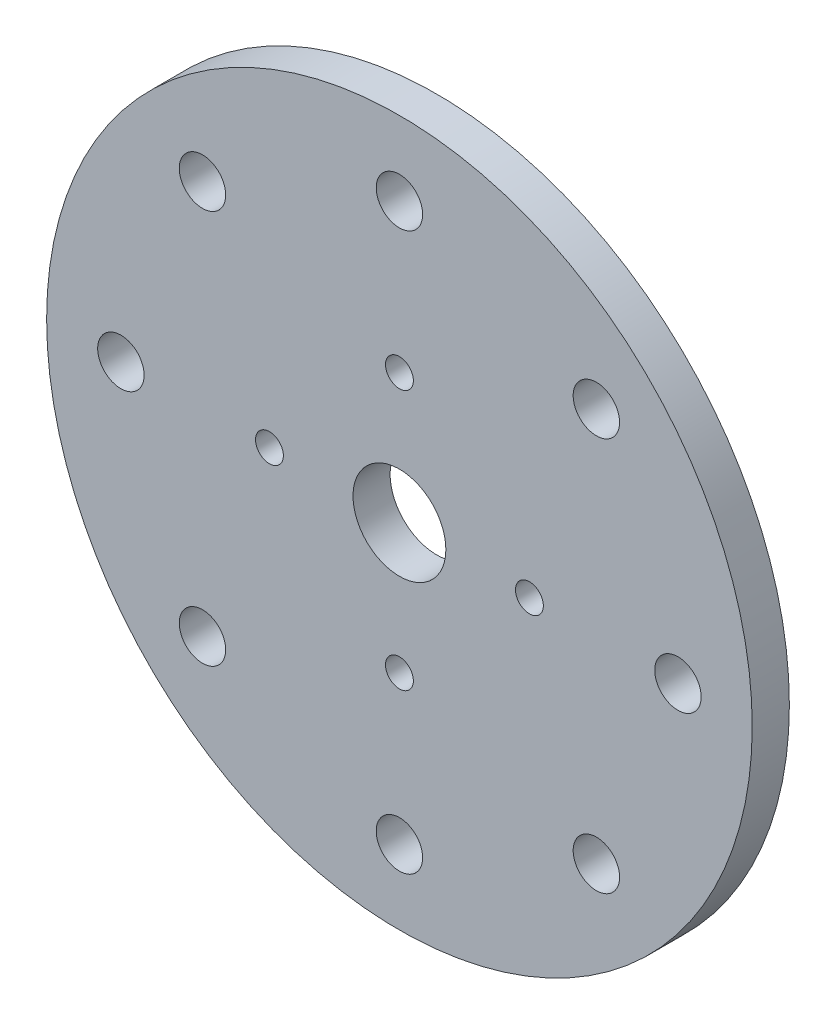
ISO-10303-21;
HEADER;
FILE_DESCRIPTION(('STEP AP214'),'2;1');
FILE_NAME('part.step','',(''),(''),'','','');
FILE_SCHEMA(('AUTOMOTIVE_DESIGN { 1 0 10303 214 1 1 1 1 }'));
ENDSEC;
DATA;
#1=APPLICATION_CONTEXT('core data for automotive mechanical design processes');
#2=APPLICATION_PROTOCOL_DEFINITION('international standard','automotive_design',2000,#1);
#3=PRODUCT_CONTEXT('',#1,'mechanical');
#4=PRODUCT('Part','Part','',(#3));
#5=PRODUCT_RELATED_PRODUCT_CATEGORY('part','',(#4));
#6=PRODUCT_DEFINITION_FORMATION('','',#4);
#7=PRODUCT_DEFINITION_CONTEXT('part definition',#1,'design');
#8=PRODUCT_DEFINITION('design','',#6,#7);
#9=PRODUCT_DEFINITION_SHAPE('','',#8);
#10=(LENGTH_UNIT() NAMED_UNIT(*) SI_UNIT(.MILLI.,.METRE.));
#11=(NAMED_UNIT(*) PLANE_ANGLE_UNIT() SI_UNIT($,.RADIAN.));
#12=(NAMED_UNIT(*) SI_UNIT($,.STERADIAN.) SOLID_ANGLE_UNIT());
#13=UNCERTAINTY_MEASURE_WITH_UNIT(LENGTH_MEASURE(1.E-05),#10,'distance_accuracy_value','');
#14=(GEOMETRIC_REPRESENTATION_CONTEXT(3) GLOBAL_UNCERTAINTY_ASSIGNED_CONTEXT((#13)) GLOBAL_UNIT_ASSIGNED_CONTEXT((#10,
#11,#12)) REPRESENTATION_CONTEXT('',''));
#15=CARTESIAN_POINT('',(0.,0.,0.));
#16=DIRECTION('',(0.,0.,1.));
#17=DIRECTION('',(1.,0.,0.));
#18=AXIS2_PLACEMENT_3D('',#15,#16,#17);
#19=CARTESIAN_POINT('',(0.,0.,4.));
#20=DIRECTION('',(0.,0.,1.));
#21=DIRECTION('',(1.,0.,0.));
#22=AXIS2_PLACEMENT_3D('',#19,#20,#21);
#23=PLANE('',#22);
#24=CARTESIAN_POINT('',(7.90664347494893E-13,-14.,4.));
#25=DIRECTION('',(0.,0.,1.));
#26=DIRECTION('',(1.,0.,0.));
#27=AXIS2_PLACEMENT_3D('',#24,#25,#26);
#28=CIRCLE('',#27,1.50000000000085);
#29=CARTESIAN_POINT('',(1.50000000000164,-14.,4.));
#30=VERTEX_POINT('',#29);
#31=EDGE_CURVE('E109',#30,#30,#28,.T.);
#32=ORIENTED_EDGE('',*,*,#31,.F.);
#33=EDGE_LOOP('',(#32));
#34=FACE_BOUND('',#33,.T.);
#35=CARTESIAN_POINT('',(-21.2132034355961,21.2132034355955,4.));
#36=DIRECTION('',(0.,0.,1.));
#37=DIRECTION('',(1.,0.,0.));
#38=AXIS2_PLACEMENT_3D('',#35,#36,#37);
#39=CIRCLE('',#38,2.50000000000097);
#40=CARTESIAN_POINT('',(-18.7132034355951,21.2132034355955,4.));
#41=VERTEX_POINT('',#40);
#42=EDGE_CURVE('E97',#41,#41,#39,.T.);
#43=ORIENTED_EDGE('',*,*,#42,.F.);
#44=EDGE_LOOP('',(#43));
#45=FACE_BOUND('',#44,.T.);
#46=CARTESIAN_POINT('',(-21.2132034355943,-21.2132034355973,4.));
#47=DIRECTION('',(0.,0.,1.));
#48=DIRECTION('',(1.,0.,0.));
#49=AXIS2_PLACEMENT_3D('',#46,#47,#48);
#50=CIRCLE('',#49,2.5000000000026);
#51=CARTESIAN_POINT('',(-18.7132034355917,-21.2132034355973,4.));
#52=VERTEX_POINT('',#51);
#53=EDGE_CURVE('E85',#52,#52,#50,.T.);
#54=ORIENTED_EDGE('',*,*,#53,.F.);
#55=EDGE_LOOP('',(#54));
#56=FACE_BOUND('',#55,.T.);
#57=CARTESIAN_POINT('',(21.2132034355986,-21.2132034355955,4.));
#58=DIRECTION('',(0.,0.,1.));
#59=DIRECTION('',(1.,0.,0.));
#60=AXIS2_PLACEMENT_3D('',#57,#58,#59);
#61=CIRCLE('',#60,2.50000000000197);
#62=CARTESIAN_POINT('',(23.7132034356006,-21.2132034355955,4.));
#63=VERTEX_POINT('',#62);
#64=EDGE_CURVE('E73',#63,#63,#61,.T.);
#65=ORIENTED_EDGE('',*,*,#64,.F.);
#66=EDGE_LOOP('',(#65));
#67=FACE_BOUND('',#66,.T.);
#68=CARTESIAN_POINT('',(21.2132034355968,21.2132034355973,4.));
#69=DIRECTION('',(0.,0.,1.));
#70=DIRECTION('',(1.,0.,0.));
#71=AXIS2_PLACEMENT_3D('',#68,#69,#70);
#72=CIRCLE('',#71,2.50000000000015);
#73=CARTESIAN_POINT('',(23.7132034355969,21.2132034355973,4.));
#74=VERTEX_POINT('',#73);
#75=EDGE_CURVE('E61',#74,#74,#72,.T.);
#76=ORIENTED_EDGE('',*,*,#75,.F.);
#77=EDGE_LOOP('',(#76));
#78=FACE_BOUND('',#77,.T.);
#79=CARTESIAN_POINT('',(0.,30.,4.));
#80=DIRECTION('',(0.,0.,1.));
#81=DIRECTION('',(1.,0.,0.));
#82=AXIS2_PLACEMENT_3D('',#79,#80,#81);
#83=CIRCLE('',#82,2.5);
#84=CARTESIAN_POINT('',(2.5,30.,4.));
#85=VERTEX_POINT('',#84);
#86=EDGE_CURVE('E49',#85,#85,#83,.T.);
#87=ORIENTED_EDGE('',*,*,#86,.F.);
#88=EDGE_LOOP('',(#87));
#89=FACE_BOUND('',#88,.T.);
#90=CARTESIAN_POINT('',(0.,0.,4.));
#91=DIRECTION('',(0.,0.,1.));
#92=DIRECTION('',(1.,0.,0.));
#93=AXIS2_PLACEMENT_3D('',#90,#91,#92);
#94=CIRCLE('',#93,38.);
#95=CARTESIAN_POINT('',(38.,0.,4.));
#96=VERTEX_POINT('',#95);
#97=EDGE_CURVE('E10',#96,#96,#94,.T.);
#98=ORIENTED_EDGE('',*,*,#97,.T.);
#99=EDGE_LOOP('',(#98));
#100=FACE_BOUND('',#99,.T.);
#101=CARTESIAN_POINT('',(0.,0.,4.));
#102=DIRECTION('',(0.,0.,1.));
#103=DIRECTION('',(1.,0.,0.));
#104=AXIS2_PLACEMENT_3D('',#101,#102,#103);
#105=CIRCLE('',#104,5.);
#106=CARTESIAN_POINT('',(5.,0.,4.));
#107=VERTEX_POINT('',#106);
#108=EDGE_CURVE('E44',#107,#107,#105,.T.);
#109=ORIENTED_EDGE('',*,*,#108,.F.);
#110=EDGE_LOOP('',(#109));
#111=FACE_BOUND('',#110,.T.);
#112=CARTESIAN_POINT('',(0.,14.,4.));
#113=DIRECTION('',(0.,0.,1.));
#114=DIRECTION('',(1.,0.,0.));
#115=AXIS2_PLACEMENT_3D('',#112,#113,#114);
#116=CIRCLE('',#115,1.5);
#117=CARTESIAN_POINT('',(1.5,14.,4.));
#118=VERTEX_POINT('',#117);
#119=EDGE_CURVE('E55',#118,#118,#116,.T.);
#120=ORIENTED_EDGE('',*,*,#119,.F.);
#121=EDGE_LOOP('',(#120));
#122=FACE_BOUND('',#121,.T.);
#123=CARTESIAN_POINT('',(30.0000000000013,1.27346601377202E-12,4.));
#124=DIRECTION('',(0.,0.,1.));
#125=DIRECTION('',(1.,0.,0.));
#126=AXIS2_PLACEMENT_3D('',#123,#124,#125);
#127=CIRCLE('',#126,2.50000000000095);
#128=CARTESIAN_POINT('',(32.5000000000022,1.27346601377202E-12,4.));
#129=VERTEX_POINT('',#128);
#130=EDGE_CURVE('E67',#129,#129,#127,.T.);
#131=ORIENTED_EDGE('',*,*,#130,.F.);
#132=EDGE_LOOP('',(#131));
#133=FACE_BOUND('',#132,.T.);
#134=CARTESIAN_POINT('',(2.54693202754403E-12,-30.,4.));
#135=DIRECTION('',(0.,0.,1.));
#136=DIRECTION('',(1.,0.,0.));
#137=AXIS2_PLACEMENT_3D('',#134,#135,#136);
#138=CIRCLE('',#137,2.50000000000264);
#139=CARTESIAN_POINT('',(2.50000000000518,-30.,4.));
#140=VERTEX_POINT('',#139);
#141=EDGE_CURVE('E79',#140,#140,#138,.T.);
#142=ORIENTED_EDGE('',*,*,#141,.F.);
#143=EDGE_LOOP('',(#142));
#144=FACE_BOUND('',#143,.T.);
#145=CARTESIAN_POINT('',(-29.9999999999987,-1.27713995416946E-12,4.));
#146=DIRECTION('',(0.,0.,1.));
#147=DIRECTION('',(1.,0.,0.));
#148=AXIS2_PLACEMENT_3D('',#145,#146,#147);
#149=CIRCLE('',#148,2.5000000000019);
#150=CARTESIAN_POINT('',(-27.4999999999968,-1.27713995416946E-12,4.));
#151=VERTEX_POINT('',#150);
#152=EDGE_CURVE('E91',#151,#151,#149,.T.);
#153=ORIENTED_EDGE('',*,*,#152,.F.);
#154=EDGE_LOOP('',(#153));
#155=FACE_BOUND('',#154,.T.);
#156=CARTESIAN_POINT('',(14.,0.,4.));
#157=DIRECTION('',(0.,0.,1.));
#158=DIRECTION('',(1.,0.,0.));
#159=AXIS2_PLACEMENT_3D('',#156,#157,#158);
#160=CIRCLE('',#159,1.5);
#161=CARTESIAN_POINT('',(15.5,0.,4.));
#162=VERTEX_POINT('',#161);
#163=EDGE_CURVE('E103',#162,#162,#160,.T.);
#164=ORIENTED_EDGE('',*,*,#163,.F.);
#165=EDGE_LOOP('',(#164));
#166=FACE_BOUND('',#165,.T.);
#167=CARTESIAN_POINT('',(-14.,1.46642216231412E-13,4.));
#168=DIRECTION('',(0.,0.,1.));
#169=DIRECTION('',(1.,0.,0.));
#170=AXIS2_PLACEMENT_3D('',#167,#168,#169);
#171=CIRCLE('',#170,1.5);
#172=CARTESIAN_POINT('',(-12.5,1.46642216231412E-13,4.));
#173=VERTEX_POINT('',#172);
#174=EDGE_CURVE('E115',#173,#173,#171,.T.);
#175=ORIENTED_EDGE('',*,*,#174,.F.);
#176=EDGE_LOOP('',(#175));
#177=FACE_BOUND('',#176,.T.);
#178=ADVANCED_FACE('F33',(#34,#45,#56,#67,#78,#89,#100,#111,#122,#133,#144,#155,#166,#177),#23,.T.);
#179=CARTESIAN_POINT('',(0.,0.,0.));
#180=DIRECTION('',(0.,0.,1.));
#181=DIRECTION('',(1.,0.,0.));
#182=AXIS2_PLACEMENT_3D('',#179,#180,#181);
#183=PLANE('',#182);
#184=CARTESIAN_POINT('',(0.,0.,0.));
#185=DIRECTION('',(0.,0.,1.));
#186=DIRECTION('',(1.,0.,0.));
#187=AXIS2_PLACEMENT_3D('',#184,#185,#186);
#188=CIRCLE('',#187,38.);
#189=CARTESIAN_POINT('',(38.,0.,0.));
#190=VERTEX_POINT('',#189);
#191=EDGE_CURVE('E37',#190,#190,#188,.T.);
#192=ORIENTED_EDGE('',*,*,#191,.F.);
#193=EDGE_LOOP('',(#192));
#194=FACE_BOUND('',#193,.T.);
#195=CARTESIAN_POINT('',(0.,0.,0.));
#196=DIRECTION('',(0.,0.,1.));
#197=DIRECTION('',(1.,0.,0.));
#198=AXIS2_PLACEMENT_3D('',#195,#196,#197);
#199=CIRCLE('',#198,5.);
#200=CARTESIAN_POINT('',(5.,0.,0.));
#201=VERTEX_POINT('',#200);
#202=EDGE_CURVE('E46',#201,#201,#199,.T.);
#203=ORIENTED_EDGE('',*,*,#202,.T.);
#204=EDGE_LOOP('',(#203));
#205=FACE_BOUND('',#204,.T.);
#206=CARTESIAN_POINT('',(0.,30.,0.));
#207=DIRECTION('',(0.,0.,1.));
#208=DIRECTION('',(1.,0.,0.));
#209=AXIS2_PLACEMENT_3D('',#206,#207,#208);
#210=CIRCLE('',#209,2.5);
#211=CARTESIAN_POINT('',(2.5,30.,0.));
#212=VERTEX_POINT('',#211);
#213=EDGE_CURVE('E52',#212,#212,#210,.T.);
#214=ORIENTED_EDGE('',*,*,#213,.T.);
#215=EDGE_LOOP('',(#214));
#216=FACE_BOUND('',#215,.T.);
#217=CARTESIAN_POINT('',(0.,14.,0.));
#218=DIRECTION('',(0.,0.,1.));
#219=DIRECTION('',(1.,0.,0.));
#220=AXIS2_PLACEMENT_3D('',#217,#218,#219);
#221=CIRCLE('',#220,1.5);
#222=CARTESIAN_POINT('',(1.5,14.,0.));
#223=VERTEX_POINT('',#222);
#224=EDGE_CURVE('E58',#223,#223,#221,.T.);
#225=ORIENTED_EDGE('',*,*,#224,.T.);
#226=EDGE_LOOP('',(#225));
#227=FACE_BOUND('',#226,.T.);
#228=CARTESIAN_POINT('',(21.2132034355968,21.2132034355973,0.));
#229=DIRECTION('',(0.,0.,1.));
#230=DIRECTION('',(1.,0.,0.));
#231=AXIS2_PLACEMENT_3D('',#228,#229,#230);
#232=CIRCLE('',#231,2.50000000000015);
#233=CARTESIAN_POINT('',(23.7132034355969,21.2132034355973,0.));
#234=VERTEX_POINT('',#233);
#235=EDGE_CURVE('E64',#234,#234,#232,.T.);
#236=ORIENTED_EDGE('',*,*,#235,.T.);
#237=EDGE_LOOP('',(#236));
#238=FACE_BOUND('',#237,.T.);
#239=CARTESIAN_POINT('',(30.0000000000013,1.27346601377202E-12,0.));
#240=DIRECTION('',(0.,0.,1.));
#241=DIRECTION('',(1.,0.,0.));
#242=AXIS2_PLACEMENT_3D('',#239,#240,#241);
#243=CIRCLE('',#242,2.50000000000095);
#244=CARTESIAN_POINT('',(32.5000000000022,1.27346601377202E-12,0.));
#245=VERTEX_POINT('',#244);
#246=EDGE_CURVE('E70',#245,#245,#243,.T.);
#247=ORIENTED_EDGE('',*,*,#246,.T.);
#248=EDGE_LOOP('',(#247));
#249=FACE_BOUND('',#248,.T.);
#250=CARTESIAN_POINT('',(21.2132034355986,-21.2132034355955,0.));
#251=DIRECTION('',(0.,0.,1.));
#252=DIRECTION('',(1.,0.,0.));
#253=AXIS2_PLACEMENT_3D('',#250,#251,#252);
#254=CIRCLE('',#253,2.50000000000197);
#255=CARTESIAN_POINT('',(23.7132034356006,-21.2132034355955,0.));
#256=VERTEX_POINT('',#255);
#257=EDGE_CURVE('E76',#256,#256,#254,.T.);
#258=ORIENTED_EDGE('',*,*,#257,.T.);
#259=EDGE_LOOP('',(#258));
#260=FACE_BOUND('',#259,.T.);
#261=CARTESIAN_POINT('',(2.54693202754403E-12,-30.,0.));
#262=DIRECTION('',(0.,0.,1.));
#263=DIRECTION('',(1.,0.,0.));
#264=AXIS2_PLACEMENT_3D('',#261,#262,#263);
#265=CIRCLE('',#264,2.50000000000264);
#266=CARTESIAN_POINT('',(2.50000000000518,-30.,0.));
#267=VERTEX_POINT('',#266);
#268=EDGE_CURVE('E82',#267,#267,#265,.T.);
#269=ORIENTED_EDGE('',*,*,#268,.T.);
#270=EDGE_LOOP('',(#269));
#271=FACE_BOUND('',#270,.T.);
#272=CARTESIAN_POINT('',(-21.2132034355943,-21.2132034355973,0.));
#273=DIRECTION('',(0.,0.,1.));
#274=DIRECTION('',(1.,0.,0.));
#275=AXIS2_PLACEMENT_3D('',#272,#273,#274);
#276=CIRCLE('',#275,2.5000000000026);
#277=CARTESIAN_POINT('',(-18.7132034355917,-21.2132034355973,0.));
#278=VERTEX_POINT('',#277);
#279=EDGE_CURVE('E88',#278,#278,#276,.T.);
#280=ORIENTED_EDGE('',*,*,#279,.T.);
#281=EDGE_LOOP('',(#280));
#282=FACE_BOUND('',#281,.T.);
#283=CARTESIAN_POINT('',(-29.9999999999987,-1.27713995416946E-12,0.));
#284=DIRECTION('',(0.,0.,1.));
#285=DIRECTION('',(1.,0.,0.));
#286=AXIS2_PLACEMENT_3D('',#283,#284,#285);
#287=CIRCLE('',#286,2.5000000000019);
#288=CARTESIAN_POINT('',(-27.4999999999968,-1.27713995416946E-12,0.));
#289=VERTEX_POINT('',#288);
#290=EDGE_CURVE('E94',#289,#289,#287,.T.);
#291=ORIENTED_EDGE('',*,*,#290,.T.);
#292=EDGE_LOOP('',(#291));
#293=FACE_BOUND('',#292,.T.);
#294=CARTESIAN_POINT('',(-21.2132034355961,21.2132034355955,0.));
#295=DIRECTION('',(0.,0.,1.));
#296=DIRECTION('',(1.,0.,0.));
#297=AXIS2_PLACEMENT_3D('',#294,#295,#296);
#298=CIRCLE('',#297,2.50000000000097);
#299=CARTESIAN_POINT('',(-18.7132034355951,21.2132034355955,0.));
#300=VERTEX_POINT('',#299);
#301=EDGE_CURVE('E100',#300,#300,#298,.T.);
#302=ORIENTED_EDGE('',*,*,#301,.T.);
#303=EDGE_LOOP('',(#302));
#304=FACE_BOUND('',#303,.T.);
#305=CARTESIAN_POINT('',(14.,0.,0.));
#306=DIRECTION('',(0.,0.,1.));
#307=DIRECTION('',(1.,0.,0.));
#308=AXIS2_PLACEMENT_3D('',#305,#306,#307);
#309=CIRCLE('',#308,1.5);
#310=CARTESIAN_POINT('',(15.5,0.,0.));
#311=VERTEX_POINT('',#310);
#312=EDGE_CURVE('E106',#311,#311,#309,.T.);
#313=ORIENTED_EDGE('',*,*,#312,.T.);
#314=EDGE_LOOP('',(#313));
#315=FACE_BOUND('',#314,.T.);
#316=CARTESIAN_POINT('',(7.90664347494893E-13,-14.,0.));
#317=DIRECTION('',(0.,0.,1.));
#318=DIRECTION('',(1.,0.,0.));
#319=AXIS2_PLACEMENT_3D('',#316,#317,#318);
#320=CIRCLE('',#319,1.50000000000085);
#321=CARTESIAN_POINT('',(1.50000000000164,-14.,0.));
#322=VERTEX_POINT('',#321);
#323=EDGE_CURVE('E112',#322,#322,#320,.T.);
#324=ORIENTED_EDGE('',*,*,#323,.T.);
#325=EDGE_LOOP('',(#324));
#326=FACE_BOUND('',#325,.T.);
#327=CARTESIAN_POINT('',(-14.,1.46642216231412E-13,0.));
#328=DIRECTION('',(0.,0.,1.));
#329=DIRECTION('',(1.,0.,0.));
#330=AXIS2_PLACEMENT_3D('',#327,#328,#329);
#331=CIRCLE('',#330,1.5);
#332=CARTESIAN_POINT('',(-12.5,1.46642216231412E-13,0.));
#333=VERTEX_POINT('',#332);
#334=EDGE_CURVE('E118',#333,#333,#331,.T.);
#335=ORIENTED_EDGE('',*,*,#334,.T.);
#336=EDGE_LOOP('',(#335));
#337=FACE_BOUND('',#336,.T.);
#338=ADVANCED_FACE('F128',(#194,#205,#216,#227,#238,#249,#260,#271,#282,#293,#304,#315,#326,
#337),#183,.F.);
#339=CARTESIAN_POINT('',(0.,0.,4.));
#340=DIRECTION('',(0.,0.,-1.));
#341=DIRECTION('',(-1.,0.,0.));
#342=AXIS2_PLACEMENT_3D('',#339,#340,#341);
#343=CYLINDRICAL_SURFACE('',#342,38.);
#344=ORIENTED_EDGE('',*,*,#97,.F.);
#345=EDGE_LOOP('',(#344));
#346=FACE_BOUND('',#345,.T.);
#347=ORIENTED_EDGE('',*,*,#191,.T.);
#348=EDGE_LOOP('',(#347));
#349=FACE_BOUND('',#348,.T.);
#350=ADVANCED_FACE('F35',(#346,#349),#343,.T.);
#351=CARTESIAN_POINT('',(0.,0.,4.));
#352=DIRECTION('',(0.,0.,-1.));
#353=DIRECTION('',(-1.,0.,0.));
#354=AXIS2_PLACEMENT_3D('',#351,#352,#353);
#355=CYLINDRICAL_SURFACE('',#354,5.);
#356=ORIENTED_EDGE('',*,*,#108,.T.);
#357=EDGE_LOOP('',(#356));
#358=FACE_BOUND('',#357,.T.);
#359=ORIENTED_EDGE('',*,*,#202,.F.);
#360=EDGE_LOOP('',(#359));
#361=FACE_BOUND('',#360,.T.);
#362=ADVANCED_FACE('F138',(#358,#361),#355,.F.);
#363=CARTESIAN_POINT('',(0.,30.,4.));
#364=DIRECTION('',(0.,0.,-1.));
#365=DIRECTION('',(-1.,0.,0.));
#366=AXIS2_PLACEMENT_3D('',#363,#364,#365);
#367=CYLINDRICAL_SURFACE('',#366,2.5);
#368=ORIENTED_EDGE('',*,*,#86,.T.);
#369=EDGE_LOOP('',(#368));
#370=FACE_BOUND('',#369,.T.);
#371=ORIENTED_EDGE('',*,*,#213,.F.);
#372=EDGE_LOOP('',(#371));
#373=FACE_BOUND('',#372,.T.);
#374=ADVANCED_FACE('F141',(#370,#373),#367,.F.);
#375=CARTESIAN_POINT('',(0.,14.,4.));
#376=DIRECTION('',(0.,0.,-1.));
#377=DIRECTION('',(-1.,0.,0.));
#378=AXIS2_PLACEMENT_3D('',#375,#376,#377);
#379=CYLINDRICAL_SURFACE('',#378,1.5);
#380=ORIENTED_EDGE('',*,*,#119,.T.);
#381=EDGE_LOOP('',(#380));
#382=FACE_BOUND('',#381,.T.);
#383=ORIENTED_EDGE('',*,*,#224,.F.);
#384=EDGE_LOOP('',(#383));
#385=FACE_BOUND('',#384,.T.);
#386=ADVANCED_FACE('F145',(#382,#385),#379,.F.);
#387=CARTESIAN_POINT('',(21.2132034355968,21.2132034355973,4.));
#388=DIRECTION('',(0.,0.,-1.));
#389=DIRECTION('',(-1.,0.,0.));
#390=AXIS2_PLACEMENT_3D('',#387,#388,#389);
#391=CYLINDRICAL_SURFACE('',#390,2.50000000000015);
#392=ORIENTED_EDGE('',*,*,#75,.T.);
#393=EDGE_LOOP('',(#392));
#394=FACE_BOUND('',#393,.T.);
#395=ORIENTED_EDGE('',*,*,#235,.F.);
#396=EDGE_LOOP('',(#395));
#397=FACE_BOUND('',#396,.T.);
#398=ADVANCED_FACE('F149',(#394,#397),#391,.F.);
#399=CARTESIAN_POINT('',(30.0000000000013,1.27346601377202E-12,4.));
#400=DIRECTION('',(0.,0.,-1.));
#401=DIRECTION('',(-1.,0.,0.));
#402=AXIS2_PLACEMENT_3D('',#399,#400,#401);
#403=CYLINDRICAL_SURFACE('',#402,2.50000000000095);
#404=ORIENTED_EDGE('',*,*,#130,.T.);
#405=EDGE_LOOP('',(#404));
#406=FACE_BOUND('',#405,.T.);
#407=ORIENTED_EDGE('',*,*,#246,.F.);
#408=EDGE_LOOP('',(#407));
#409=FACE_BOUND('',#408,.T.);
#410=ADVANCED_FACE('F153',(#406,#409),#403,.F.);
#411=CARTESIAN_POINT('',(21.2132034355986,-21.2132034355955,4.));
#412=DIRECTION('',(0.,0.,-1.));
#413=DIRECTION('',(-1.,0.,0.));
#414=AXIS2_PLACEMENT_3D('',#411,#412,#413);
#415=CYLINDRICAL_SURFACE('',#414,2.50000000000197);
#416=ORIENTED_EDGE('',*,*,#64,.T.);
#417=EDGE_LOOP('',(#416));
#418=FACE_BOUND('',#417,.T.);
#419=ORIENTED_EDGE('',*,*,#257,.F.);
#420=EDGE_LOOP('',(#419));
#421=FACE_BOUND('',#420,.T.);
#422=ADVANCED_FACE('F157',(#418,#421),#415,.F.);
#423=CARTESIAN_POINT('',(2.54693202754403E-12,-30.,4.));
#424=DIRECTION('',(0.,0.,-1.));
#425=DIRECTION('',(-1.,0.,0.));
#426=AXIS2_PLACEMENT_3D('',#423,#424,#425);
#427=CYLINDRICAL_SURFACE('',#426,2.50000000000264);
#428=ORIENTED_EDGE('',*,*,#141,.T.);
#429=EDGE_LOOP('',(#428));
#430=FACE_BOUND('',#429,.T.);
#431=ORIENTED_EDGE('',*,*,#268,.F.);
#432=EDGE_LOOP('',(#431));
#433=FACE_BOUND('',#432,.T.);
#434=ADVANCED_FACE('F161',(#430,#433),#427,.F.);
#435=CARTESIAN_POINT('',(-21.2132034355943,-21.2132034355973,4.));
#436=DIRECTION('',(0.,0.,-1.));
#437=DIRECTION('',(-1.,0.,0.));
#438=AXIS2_PLACEMENT_3D('',#435,#436,#437);
#439=CYLINDRICAL_SURFACE('',#438,2.5000000000026);
#440=ORIENTED_EDGE('',*,*,#53,.T.);
#441=EDGE_LOOP('',(#440));
#442=FACE_BOUND('',#441,.T.);
#443=ORIENTED_EDGE('',*,*,#279,.F.);
#444=EDGE_LOOP('',(#443));
#445=FACE_BOUND('',#444,.T.);
#446=ADVANCED_FACE('F165',(#442,#445),#439,.F.);
#447=CARTESIAN_POINT('',(-29.9999999999987,-1.27713995416946E-12,4.));
#448=DIRECTION('',(0.,0.,-1.));
#449=DIRECTION('',(-1.,0.,0.));
#450=AXIS2_PLACEMENT_3D('',#447,#448,#449);
#451=CYLINDRICAL_SURFACE('',#450,2.5000000000019);
#452=ORIENTED_EDGE('',*,*,#152,.T.);
#453=EDGE_LOOP('',(#452));
#454=FACE_BOUND('',#453,.T.);
#455=ORIENTED_EDGE('',*,*,#290,.F.);
#456=EDGE_LOOP('',(#455));
#457=FACE_BOUND('',#456,.T.);
#458=ADVANCED_FACE('F169',(#454,#457),#451,.F.);
#459=CARTESIAN_POINT('',(-21.2132034355961,21.2132034355955,4.));
#460=DIRECTION('',(0.,0.,-1.));
#461=DIRECTION('',(-1.,0.,0.));
#462=AXIS2_PLACEMENT_3D('',#459,#460,#461);
#463=CYLINDRICAL_SURFACE('',#462,2.50000000000097);
#464=ORIENTED_EDGE('',*,*,#42,.T.);
#465=EDGE_LOOP('',(#464));
#466=FACE_BOUND('',#465,.T.);
#467=ORIENTED_EDGE('',*,*,#301,.F.);
#468=EDGE_LOOP('',(#467));
#469=FACE_BOUND('',#468,.T.);
#470=ADVANCED_FACE('F173',(#466,#469),#463,.F.);
#471=CARTESIAN_POINT('',(14.,0.,4.));
#472=DIRECTION('',(0.,0.,-1.));
#473=DIRECTION('',(-1.,0.,0.));
#474=AXIS2_PLACEMENT_3D('',#471,#472,#473);
#475=CYLINDRICAL_SURFACE('',#474,1.5);
#476=ORIENTED_EDGE('',*,*,#163,.T.);
#477=EDGE_LOOP('',(#476));
#478=FACE_BOUND('',#477,.T.);
#479=ORIENTED_EDGE('',*,*,#312,.F.);
#480=EDGE_LOOP('',(#479));
#481=FACE_BOUND('',#480,.T.);
#482=ADVANCED_FACE('F177',(#478,#481),#475,.F.);
#483=CARTESIAN_POINT('',(7.90664347494893E-13,-14.,4.));
#484=DIRECTION('',(0.,0.,-1.));
#485=DIRECTION('',(-1.,0.,0.));
#486=AXIS2_PLACEMENT_3D('',#483,#484,#485);
#487=CYLINDRICAL_SURFACE('',#486,1.50000000000085);
#488=ORIENTED_EDGE('',*,*,#31,.T.);
#489=EDGE_LOOP('',(#488));
#490=FACE_BOUND('',#489,.T.);
#491=ORIENTED_EDGE('',*,*,#323,.F.);
#492=EDGE_LOOP('',(#491));
#493=FACE_BOUND('',#492,.T.);
#494=ADVANCED_FACE('F181',(#490,#493),#487,.F.);
#495=CARTESIAN_POINT('',(-14.,1.46642216231412E-13,4.));
#496=DIRECTION('',(0.,0.,-1.));
#497=DIRECTION('',(-1.,0.,0.));
#498=AXIS2_PLACEMENT_3D('',#495,#496,#497);
#499=CYLINDRICAL_SURFACE('',#498,1.5);
#500=ORIENTED_EDGE('',*,*,#174,.T.);
#501=EDGE_LOOP('',(#500));
#502=FACE_BOUND('',#501,.T.);
#503=ORIENTED_EDGE('',*,*,#334,.F.);
#504=EDGE_LOOP('',(#503));
#505=FACE_BOUND('',#504,.T.);
#506=ADVANCED_FACE('F124',(#502,#505),#499,.F.);
#507=CLOSED_SHELL('',(#178,#338,#350,#362,#374,#386,#398,#410,#422,#434,#446,#458,#470,#482,
#494,#506));
#508=MANIFOLD_SOLID_BREP('B2',#507);
#509=ADVANCED_BREP_SHAPE_REPRESENTATION('',(#18,#508),#14);
#510=SHAPE_DEFINITION_REPRESENTATION(#9,#509);
ENDSEC;
END-ISO-10303-21;
